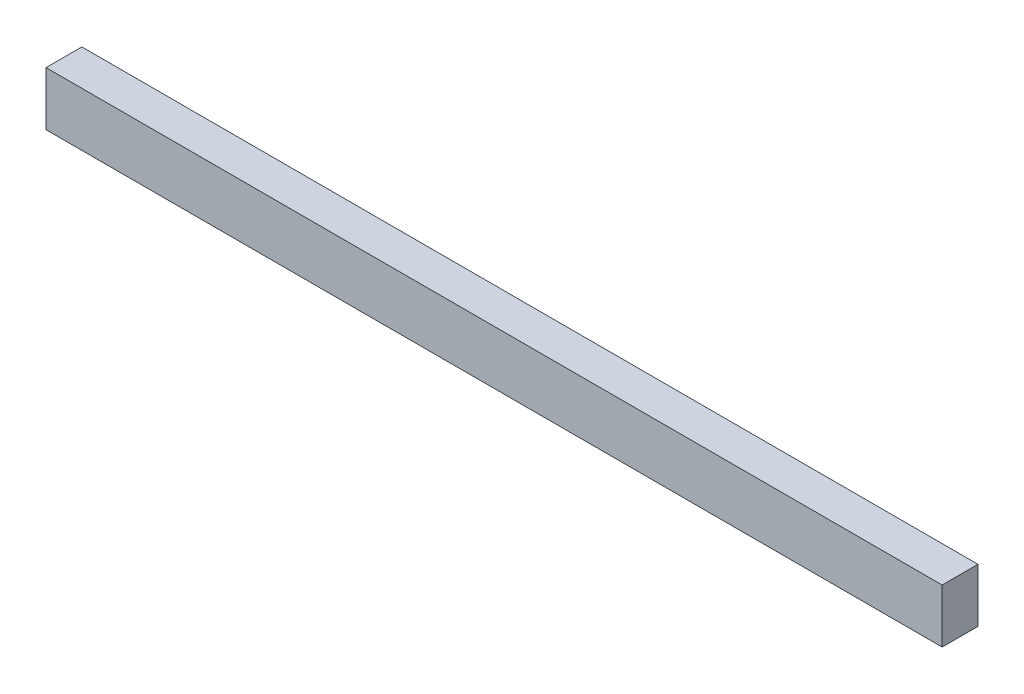
ISO-10303-21;
HEADER;
FILE_DESCRIPTION(('STEP AP214'),'2;1');
FILE_NAME('part.step','',(''),(''),'','','');
FILE_SCHEMA(('AUTOMOTIVE_DESIGN { 1 0 10303 214 1 1 1 1 }'));
ENDSEC;
DATA;
#1=APPLICATION_CONTEXT('core data for automotive mechanical design processes');
#2=APPLICATION_PROTOCOL_DEFINITION('international standard','automotive_design',2000,#1);
#3=PRODUCT_CONTEXT('',#1,'mechanical');
#4=PRODUCT('Part','Part','',(#3));
#5=PRODUCT_RELATED_PRODUCT_CATEGORY('part','',(#4));
#6=PRODUCT_DEFINITION_FORMATION('','',#4);
#7=PRODUCT_DEFINITION_CONTEXT('part definition',#1,'design');
#8=PRODUCT_DEFINITION('design','',#6,#7);
#9=PRODUCT_DEFINITION_SHAPE('','',#8);
#10=(LENGTH_UNIT() NAMED_UNIT(*) SI_UNIT(.MILLI.,.METRE.));
#11=(NAMED_UNIT(*) PLANE_ANGLE_UNIT() SI_UNIT($,.RADIAN.));
#12=(NAMED_UNIT(*) SI_UNIT($,.STERADIAN.) SOLID_ANGLE_UNIT());
#13=UNCERTAINTY_MEASURE_WITH_UNIT(LENGTH_MEASURE(1.E-05),#10,'distance_accuracy_value','');
#14=(GEOMETRIC_REPRESENTATION_CONTEXT(3) GLOBAL_UNCERTAINTY_ASSIGNED_CONTEXT((#13)) GLOBAL_UNIT_ASSIGNED_CONTEXT((#10,
#11,#12)) REPRESENTATION_CONTEXT('',''));
#15=CARTESIAN_POINT('',(0.,0.,0.));
#16=DIRECTION('',(0.,0.,1.));
#17=DIRECTION('',(1.,0.,0.));
#18=AXIS2_PLACEMENT_3D('',#15,#16,#17);
#19=CARTESIAN_POINT('',(-635.,-38.1000000000001,50.8));
#20=DIRECTION('',(1.,0.,0.));
#21=DIRECTION('',(0.,0.,-1.));
#22=AXIS2_PLACEMENT_3D('',#19,#20,#21);
#23=PLANE('',#22);
#24=DIRECTION('',(0.,-1.,0.));
#25=VECTOR('',#24,1.);
#26=CARTESIAN_POINT('',(-635.,-38.1000000000001,0.));
#27=LINE('',#26,#25);
#28=CARTESIAN_POINT('',(-635.,38.0999999999999,0.));
#29=VERTEX_POINT('',#28);
#30=CARTESIAN_POINT('',(-635.,-38.1000000000001,0.));
#31=VERTEX_POINT('',#30);
#32=EDGE_CURVE('E96',#29,#31,#27,.T.);
#33=ORIENTED_EDGE('',*,*,#32,.T.);
#34=DIRECTION('',(0.,0.,-1.));
#35=VECTOR('',#34,1.);
#36=CARTESIAN_POINT('',(-635.,-38.1000000000001,50.8));
#37=LINE('',#36,#35);
#38=CARTESIAN_POINT('',(-635.,-38.1000000000001,50.8));
#39=VERTEX_POINT('',#38);
#40=EDGE_CURVE('E11',#39,#31,#37,.T.);
#41=ORIENTED_EDGE('',*,*,#40,.F.);
#42=DIRECTION('',(0.,-1.,0.));
#43=VECTOR('',#42,1.);
#44=CARTESIAN_POINT('',(-635.,-38.1000000000001,50.8));
#45=LINE('',#44,#43);
#46=CARTESIAN_POINT('',(-635.,38.0999999999999,50.8));
#47=VERTEX_POINT('',#46);
#48=EDGE_CURVE('E84',#47,#39,#45,.T.);
#49=ORIENTED_EDGE('',*,*,#48,.F.);
#50=DIRECTION('',(0.,0.,-1.));
#51=VECTOR('',#50,1.);
#52=CARTESIAN_POINT('',(-635.,38.0999999999999,50.8));
#53=LINE('',#52,#51);
#54=EDGE_CURVE('E92',#47,#29,#53,.T.);
#55=ORIENTED_EDGE('',*,*,#54,.T.);
#56=EDGE_LOOP('',(#33,#41,#49,#55));
#57=FACE_BOUND('',#56,.T.);
#58=ADVANCED_FACE('F33',(#57),#23,.F.);
#59=CARTESIAN_POINT('',(635.,-38.0999999999999,50.8));
#60=DIRECTION('',(0.,1.,0.));
#61=DIRECTION('',(-1.,0.,0.));
#62=AXIS2_PLACEMENT_3D('',#59,#60,#61);
#63=PLANE('',#62);
#64=DIRECTION('',(1.,0.,0.));
#65=VECTOR('',#64,1.);
#66=CARTESIAN_POINT('',(635.,-38.0999999999999,0.));
#67=LINE('',#66,#65);
#68=CARTESIAN_POINT('',(635.,-38.0999999999999,0.));
#69=VERTEX_POINT('',#68);
#70=EDGE_CURVE('E88',#31,#69,#67,.T.);
#71=ORIENTED_EDGE('',*,*,#70,.T.);
#72=DIRECTION('',(0.,0.,-1.));
#73=VECTOR('',#72,1.);
#74=CARTESIAN_POINT('',(635.,-38.0999999999999,50.8));
#75=LINE('',#74,#73);
#76=CARTESIAN_POINT('',(635.,-38.0999999999999,50.8));
#77=VERTEX_POINT('',#76);
#78=EDGE_CURVE('E41',#77,#69,#75,.T.);
#79=ORIENTED_EDGE('',*,*,#78,.F.);
#80=DIRECTION('',(1.,0.,0.));
#81=VECTOR('',#80,1.);
#82=CARTESIAN_POINT('',(635.,-38.0999999999999,50.8));
#83=LINE('',#82,#81);
#84=EDGE_CURVE('E79',#39,#77,#83,.T.);
#85=ORIENTED_EDGE('',*,*,#84,.F.);
#86=ORIENTED_EDGE('',*,*,#40,.T.);
#87=EDGE_LOOP('',(#71,#79,#85,#86));
#88=FACE_BOUND('',#87,.T.);
#89=ADVANCED_FACE('F87',(#88),#63,.F.);
#90=CARTESIAN_POINT('',(635.,-38.0999999999999,50.8));
#91=DIRECTION('',(-1.,0.,0.));
#92=DIRECTION('',(0.,0.,1.));
#93=AXIS2_PLACEMENT_3D('',#90,#91,#92);
#94=PLANE('',#93);
#95=DIRECTION('',(0.,1.,0.));
#96=VECTOR('',#95,1.);
#97=CARTESIAN_POINT('',(635.,-38.0999999999999,0.));
#98=LINE('',#97,#96);
#99=CARTESIAN_POINT('',(635.,38.1000000000001,0.));
#100=VERTEX_POINT('',#99);
#101=EDGE_CURVE('E66',#69,#100,#98,.T.);
#102=ORIENTED_EDGE('',*,*,#101,.T.);
#103=DIRECTION('',(0.,0.,-1.));
#104=VECTOR('',#103,1.);
#105=CARTESIAN_POINT('',(635.,38.1000000000001,50.8));
#106=LINE('',#105,#104);
#107=CARTESIAN_POINT('',(635.,38.1000000000001,50.8));
#108=VERTEX_POINT('',#107);
#109=EDGE_CURVE('E89',#108,#100,#106,.T.);
#110=ORIENTED_EDGE('',*,*,#109,.F.);
#111=DIRECTION('',(0.,1.,0.));
#112=VECTOR('',#111,1.);
#113=CARTESIAN_POINT('',(635.,-38.0999999999999,50.8));
#114=LINE('',#113,#112);
#115=EDGE_CURVE('E82',#77,#108,#114,.T.);
#116=ORIENTED_EDGE('',*,*,#115,.F.);
#117=ORIENTED_EDGE('',*,*,#78,.T.);
#118=EDGE_LOOP('',(#102,#110,#116,#117));
#119=FACE_BOUND('',#118,.T.);
#120=ADVANCED_FACE('F90',(#119),#94,.F.);
#121=CARTESIAN_POINT('',(635.,38.1000000000001,50.8));
#122=DIRECTION('',(0.,-1.,0.));
#123=DIRECTION('',(1.,0.,0.));
#124=AXIS2_PLACEMENT_3D('',#121,#122,#123);
#125=PLANE('',#124);
#126=DIRECTION('',(-1.,0.,0.));
#127=VECTOR('',#126,1.);
#128=CARTESIAN_POINT('',(635.,38.1000000000001,0.));
#129=LINE('',#128,#127);
#130=EDGE_CURVE('E72',#100,#29,#129,.T.);
#131=ORIENTED_EDGE('',*,*,#130,.T.);
#132=ORIENTED_EDGE('',*,*,#54,.F.);
#133=DIRECTION('',(-1.,0.,0.));
#134=VECTOR('',#133,1.);
#135=CARTESIAN_POINT('',(635.,38.1000000000001,50.8));
#136=LINE('',#135,#134);
#137=EDGE_CURVE('E49',#108,#47,#136,.T.);
#138=ORIENTED_EDGE('',*,*,#137,.F.);
#139=ORIENTED_EDGE('',*,*,#109,.T.);
#140=EDGE_LOOP('',(#131,#132,#138,#139));
#141=FACE_BOUND('',#140,.T.);
#142=ADVANCED_FACE('F103',(#141),#125,.F.);
#143=CARTESIAN_POINT('',(0.,0.,50.8));
#144=DIRECTION('',(0.,0.,1.));
#145=DIRECTION('',(1.,0.,0.));
#146=AXIS2_PLACEMENT_3D('',#143,#144,#145);
#147=PLANE('',#146);
#148=ORIENTED_EDGE('',*,*,#48,.T.);
#149=ORIENTED_EDGE('',*,*,#84,.T.);
#150=ORIENTED_EDGE('',*,*,#115,.T.);
#151=ORIENTED_EDGE('',*,*,#137,.T.);
#152=EDGE_LOOP('',(#148,#149,#150,#151));
#153=FACE_BOUND('',#152,.T.);
#154=ADVANCED_FACE('F80',(#153),#147,.T.);
#155=CARTESIAN_POINT('',(0.,0.,0.));
#156=DIRECTION('',(0.,0.,1.));
#157=DIRECTION('',(1.,0.,0.));
#158=AXIS2_PLACEMENT_3D('',#155,#156,#157);
#159=PLANE('',#158);
#160=ORIENTED_EDGE('',*,*,#32,.F.);
#161=ORIENTED_EDGE('',*,*,#130,.F.);
#162=ORIENTED_EDGE('',*,*,#101,.F.);
#163=ORIENTED_EDGE('',*,*,#70,.F.);
#164=EDGE_LOOP('',(#160,#161,#162,#163));
#165=FACE_BOUND('',#164,.T.);
#166=ADVANCED_FACE('F106',(#165),#159,.F.);
#167=CLOSED_SHELL('',(#58,#89,#120,#142,#154,#166));
#168=MANIFOLD_SOLID_BREP('B2',#167);
#169=ADVANCED_BREP_SHAPE_REPRESENTATION('',(#18,#168),#14);
#170=SHAPE_DEFINITION_REPRESENTATION(#9,#169);
ENDSEC;
END-ISO-10303-21;
